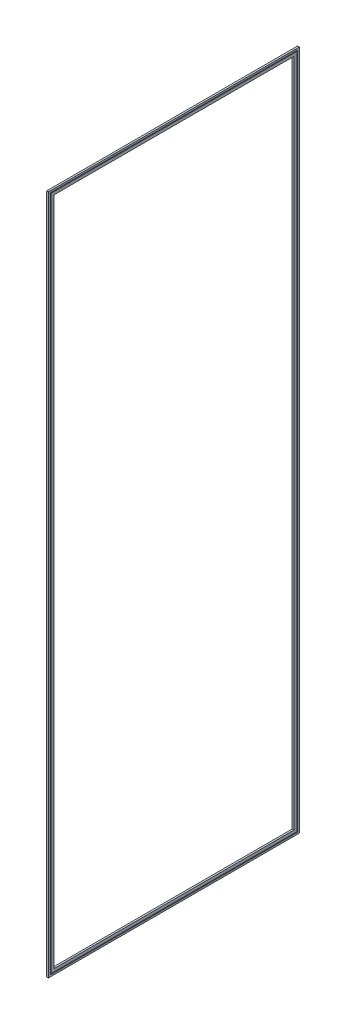
ISO-10303-21;
HEADER;
FILE_DESCRIPTION(('STEP AP214'),'2;1');
FILE_NAME('part.step','',(''),(''),'','','');
FILE_SCHEMA(('AUTOMOTIVE_DESIGN { 1 0 10303 214 1 1 1 1 }'));
ENDSEC;
DATA;
#1=APPLICATION_CONTEXT('core data for automotive mechanical design processes');
#2=APPLICATION_PROTOCOL_DEFINITION('international standard','automotive_design',2000,#1);
#3=PRODUCT_CONTEXT('',#1,'mechanical');
#4=PRODUCT('Part','Part','',(#3));
#5=PRODUCT_RELATED_PRODUCT_CATEGORY('part','',(#4));
#6=PRODUCT_DEFINITION_FORMATION('','',#4);
#7=PRODUCT_DEFINITION_CONTEXT('part definition',#1,'design');
#8=PRODUCT_DEFINITION('design','',#6,#7);
#9=PRODUCT_DEFINITION_SHAPE('','',#8);
#10=(LENGTH_UNIT() NAMED_UNIT(*) SI_UNIT(.MILLI.,.METRE.));
#11=(NAMED_UNIT(*) PLANE_ANGLE_UNIT() SI_UNIT($,.RADIAN.));
#12=(NAMED_UNIT(*) SI_UNIT($,.STERADIAN.) SOLID_ANGLE_UNIT());
#13=UNCERTAINTY_MEASURE_WITH_UNIT(LENGTH_MEASURE(1.E-05),#10,'distance_accuracy_value','');
#14=(GEOMETRIC_REPRESENTATION_CONTEXT(3) GLOBAL_UNCERTAINTY_ASSIGNED_CONTEXT((#13)) GLOBAL_UNIT_ASSIGNED_CONTEXT((#10,
#11,#12)) REPRESENTATION_CONTEXT('',''));
#15=CARTESIAN_POINT('',(0.,0.,0.));
#16=DIRECTION('',(0.,0.,1.));
#17=DIRECTION('',(1.,0.,0.));
#18=AXIS2_PLACEMENT_3D('',#15,#16,#17);
#19=CARTESIAN_POINT('',(0.4,-189.,69.0000000000001));
#20=DIRECTION('',(0.,-1.,0.));
#21=DIRECTION('',(0.,0.,-1.));
#22=AXIS2_PLACEMENT_3D('',#19,#20,#21);
#23=PLANE('',#22);
#24=DIRECTION('',(0.,0.,1.));
#25=VECTOR('',#24,1.);
#26=CARTESIAN_POINT('',(0.799999999999995,-189.,-68.9999999999999));
#27=LINE('',#26,#25);
#28=CARTESIAN_POINT('',(0.799999999999974,-189.,-69.0000000000001));
#29=VERTEX_POINT('',#28);
#30=CARTESIAN_POINT('',(0.800000000000002,-189.,69.0000000000001));
#31=VERTEX_POINT('',#30);
#32=EDGE_CURVE('E63',#29,#31,#27,.T.);
#33=ORIENTED_EDGE('',*,*,#32,.T.);
#34=DIRECTION('',(1.,0.,0.));
#35=VECTOR('',#34,1.);
#36=CARTESIAN_POINT('',(0.4,-189.,69.0000000000001));
#37=LINE('',#36,#35);
#38=CARTESIAN_POINT('',(1.,-189.,69.0000000000001));
#39=VERTEX_POINT('',#38);
#40=EDGE_CURVE('E306',#31,#39,#37,.T.);
#41=ORIENTED_EDGE('',*,*,#40,.T.);
#42=DIRECTION('',(0.,0.,-1.));
#43=VECTOR('',#42,1.);
#44=CARTESIAN_POINT('',(1.,-189.,69.0000000000001));
#45=LINE('',#44,#43);
#46=CARTESIAN_POINT('',(1.,-189.,-69.0000000000001));
#47=VERTEX_POINT('',#46);
#48=EDGE_CURVE('E271',#39,#47,#45,.T.);
#49=ORIENTED_EDGE('',*,*,#48,.T.);
#50=DIRECTION('',(1.,0.,0.));
#51=VECTOR('',#50,1.);
#52=CARTESIAN_POINT('',(0.4,-189.,-69.0000000000001));
#53=LINE('',#52,#51);
#54=EDGE_CURVE('E291',#29,#47,#53,.T.);
#55=ORIENTED_EDGE('',*,*,#54,.F.);
#56=EDGE_LOOP('',(#33,#41,#49,#55));
#57=FACE_BOUND('',#56,.T.);
#58=ADVANCED_FACE('F48',(#57),#23,.F.);
#59=CARTESIAN_POINT('',(0.4,189.,69.0000000000001));
#60=DIRECTION('',(0.,0.,1.));
#61=DIRECTION('',(1.,0.,0.));
#62=AXIS2_PLACEMENT_3D('',#59,#60,#61);
#63=PLANE('',#62);
#64=DIRECTION('',(0.,1.,0.));
#65=VECTOR('',#64,1.);
#66=CARTESIAN_POINT('',(0.800000000000002,-189.,69.0000000000001));
#67=LINE('',#66,#65);
#68=CARTESIAN_POINT('',(0.799999999999961,189.,69.0000000000002));
#69=VERTEX_POINT('',#68);
#70=EDGE_CURVE('E228',#31,#69,#67,.T.);
#71=ORIENTED_EDGE('',*,*,#70,.T.);
#72=DIRECTION('',(1.,0.,0.));
#73=VECTOR('',#72,1.);
#74=CARTESIAN_POINT('',(0.4,189.,69.0000000000001));
#75=LINE('',#74,#73);
#76=CARTESIAN_POINT('',(1.,189.,69.0000000000001));
#77=VERTEX_POINT('',#76);
#78=EDGE_CURVE('E310',#69,#77,#75,.T.);
#79=ORIENTED_EDGE('',*,*,#78,.T.);
#80=DIRECTION('',(0.,-1.,0.));
#81=VECTOR('',#80,1.);
#82=CARTESIAN_POINT('',(1.,189.,69.0000000000001));
#83=LINE('',#82,#81);
#84=EDGE_CURVE('E282',#77,#39,#83,.T.);
#85=ORIENTED_EDGE('',*,*,#84,.T.);
#86=ORIENTED_EDGE('',*,*,#40,.F.);
#87=EDGE_LOOP('',(#71,#79,#85,#86));
#88=FACE_BOUND('',#87,.T.);
#89=ADVANCED_FACE('F401',(#88),#63,.F.);
#90=CARTESIAN_POINT('',(0.4,189.,69.0000000000001));
#91=DIRECTION('',(0.,1.,0.));
#92=DIRECTION('',(0.,0.,1.));
#93=AXIS2_PLACEMENT_3D('',#90,#91,#92);
#94=PLANE('',#93);
#95=DIRECTION('',(0.,0.,1.));
#96=VECTOR('',#95,1.);
#97=CARTESIAN_POINT('',(0.799999999999954,189.,-68.9999999999998));
#98=LINE('',#97,#96);
#99=CARTESIAN_POINT('',(0.799999999999954,189.,-68.9999999999998));
#100=VERTEX_POINT('',#99);
#101=EDGE_CURVE('E226',#100,#69,#98,.T.);
#102=ORIENTED_EDGE('',*,*,#101,.F.);
#103=DIRECTION('',(1.,0.,0.));
#104=VECTOR('',#103,1.);
#105=CARTESIAN_POINT('',(0.4,189.,-69.0000000000001));
#106=LINE('',#105,#104);
#107=CARTESIAN_POINT('',(1.,189.,-69.0000000000001));
#108=VERTEX_POINT('',#107);
#109=EDGE_CURVE('E314',#100,#108,#106,.T.);
#110=ORIENTED_EDGE('',*,*,#109,.T.);
#111=DIRECTION('',(0.,0.,1.));
#112=VECTOR('',#111,1.);
#113=CARTESIAN_POINT('',(1.,189.,69.0000000000001));
#114=LINE('',#113,#112);
#115=EDGE_CURVE('E297',#108,#77,#114,.T.);
#116=ORIENTED_EDGE('',*,*,#115,.T.);
#117=ORIENTED_EDGE('',*,*,#78,.F.);
#118=EDGE_LOOP('',(#102,#110,#116,#117));
#119=FACE_BOUND('',#118,.T.);
#120=ADVANCED_FACE('F409',(#119),#94,.F.);
#121=CARTESIAN_POINT('',(0.4,189.,-69.0000000000001));
#122=DIRECTION('',(0.,0.,-1.));
#123=DIRECTION('',(-1.,0.,0.));
#124=AXIS2_PLACEMENT_3D('',#121,#122,#123);
#125=PLANE('',#124);
#126=DIRECTION('',(0.,1.,0.));
#127=VECTOR('',#126,1.);
#128=CARTESIAN_POINT('',(0.799999999999995,-189.,-68.9999999999999));
#129=LINE('',#128,#127);
#130=EDGE_CURVE('E224',#29,#100,#129,.T.);
#131=ORIENTED_EDGE('',*,*,#130,.F.);
#132=ORIENTED_EDGE('',*,*,#54,.T.);
#133=DIRECTION('',(0.,1.,0.));
#134=VECTOR('',#133,1.);
#135=CARTESIAN_POINT('',(1.,189.,-69.0000000000001));
#136=LINE('',#135,#134);
#137=EDGE_CURVE('E294',#47,#108,#136,.T.);
#138=ORIENTED_EDGE('',*,*,#137,.T.);
#139=ORIENTED_EDGE('',*,*,#109,.F.);
#140=EDGE_LOOP('',(#131,#132,#138,#139));
#141=FACE_BOUND('',#140,.T.);
#142=ADVANCED_FACE('F477',(#141),#125,.F.);
#143=CARTESIAN_POINT('',(1.,0.,0.));
#144=DIRECTION('',(-1.,0.,0.));
#145=DIRECTION('',(0.,0.,1.));
#146=AXIS2_PLACEMENT_3D('',#143,#144,#145);
#147=PLANE('',#146);
#148=DIRECTION('',(0.,1.,0.));
#149=VECTOR('',#148,1.);
#150=CARTESIAN_POINT('',(1.,-187.,-66.9999999999999));
#151=LINE('',#150,#149);
#152=CARTESIAN_POINT('',(1.,-187.,-66.9999999999999));
#153=VERTEX_POINT('',#152);
#154=CARTESIAN_POINT('',(1.,187.,-66.9999999999999));
#155=VERTEX_POINT('',#154);
#156=EDGE_CURVE('E318',#153,#155,#151,.T.);
#157=ORIENTED_EDGE('',*,*,#156,.F.);
#158=DIRECTION('',(0.,0.,-1.));
#159=VECTOR('',#158,1.);
#160=CARTESIAN_POINT('',(1.,-187.,-66.9999999999999));
#161=LINE('',#160,#159);
#162=CARTESIAN_POINT('',(1.,-187.,67.0000000000001));
#163=VERTEX_POINT('',#162);
#164=EDGE_CURVE('E326',#163,#153,#161,.T.);
#165=ORIENTED_EDGE('',*,*,#164,.F.);
#166=DIRECTION('',(0.,-1.,0.));
#167=VECTOR('',#166,1.);
#168=CARTESIAN_POINT('',(1.,-187.,67.0000000000001));
#169=LINE('',#168,#167);
#170=CARTESIAN_POINT('',(1.,187.,67.0000000000001));
#171=VERTEX_POINT('',#170);
#172=EDGE_CURVE('E323',#171,#163,#169,.T.);
#173=ORIENTED_EDGE('',*,*,#172,.F.);
#174=DIRECTION('',(0.,0.,1.));
#175=VECTOR('',#174,1.);
#176=CARTESIAN_POINT('',(1.,187.,-66.9999999999999));
#177=LINE('',#176,#175);
#178=EDGE_CURVE('E320',#155,#171,#177,.T.);
#179=ORIENTED_EDGE('',*,*,#178,.F.);
#180=EDGE_LOOP('',(#157,#165,#173,#179));
#181=FACE_BOUND('',#180,.T.);
#182=DIRECTION('',(0.,-1.,0.));
#183=VECTOR('',#182,1.);
#184=CARTESIAN_POINT('',(1.,188.6,68.6000000000001));
#185=LINE('',#184,#183);
#186=CARTESIAN_POINT('',(1.,188.6,68.6000000000001));
#187=VERTEX_POINT('',#186);
#188=CARTESIAN_POINT('',(1.,-188.6,68.6000000000001));
#189=VERTEX_POINT('',#188);
#190=EDGE_CURVE('E244',#187,#189,#185,.T.);
#191=ORIENTED_EDGE('',*,*,#190,.T.);
#192=DIRECTION('',(0.,0.,-1.));
#193=VECTOR('',#192,1.);
#194=CARTESIAN_POINT('',(1.,-188.6,68.6000000000001));
#195=LINE('',#194,#193);
#196=CARTESIAN_POINT('',(1.,-188.6,-68.6000000000001));
#197=VERTEX_POINT('',#196);
#198=EDGE_CURVE('E261',#189,#197,#195,.T.);
#199=ORIENTED_EDGE('',*,*,#198,.T.);
#200=DIRECTION('',(0.,1.,0.));
#201=VECTOR('',#200,1.);
#202=CARTESIAN_POINT('',(1.,188.6,-68.6000000000001));
#203=LINE('',#202,#201);
#204=CARTESIAN_POINT('',(1.,188.6,-68.6000000000001));
#205=VERTEX_POINT('',#204);
#206=EDGE_CURVE('E264',#197,#205,#203,.T.);
#207=ORIENTED_EDGE('',*,*,#206,.T.);
#208=DIRECTION('',(0.,0.,1.));
#209=VECTOR('',#208,1.);
#210=CARTESIAN_POINT('',(1.,188.6,68.6000000000001));
#211=LINE('',#210,#209);
#212=EDGE_CURVE('E249',#205,#187,#211,.T.);
#213=ORIENTED_EDGE('',*,*,#212,.T.);
#214=EDGE_LOOP('',(#191,#199,#207,#213));
#215=FACE_BOUND('',#214,.T.);
#216=ADVANCED_FACE('F480',(#181,#215),#147,.F.);
#217=ORIENTED_EDGE('',*,*,#137,.F.);
#218=ORIENTED_EDGE('',*,*,#48,.F.);
#219=ORIENTED_EDGE('',*,*,#84,.F.);
#220=ORIENTED_EDGE('',*,*,#115,.F.);
#221=EDGE_LOOP('',(#217,#218,#219,#220));
#222=FACE_BOUND('',#221,.T.);
#223=DIRECTION('',(0.,0.,1.));
#224=VECTOR('',#223,1.);
#225=CARTESIAN_POINT('',(1.,190.,-70.));
#226=LINE('',#225,#224);
#227=CARTESIAN_POINT('',(1.,190.,-70.));
#228=VERTEX_POINT('',#227);
#229=CARTESIAN_POINT('',(1.,190.,70.0000000000001));
#230=VERTEX_POINT('',#229);
#231=EDGE_CURVE('E349',#228,#230,#226,.T.);
#232=ORIENTED_EDGE('',*,*,#231,.T.);
#233=DIRECTION('',(0.,-1.,0.));
#234=VECTOR('',#233,1.);
#235=CARTESIAN_POINT('',(1.,-190.,70.0000000000001));
#236=LINE('',#235,#234);
#237=CARTESIAN_POINT('',(1.,-190.,70.0000000000001));
#238=VERTEX_POINT('',#237);
#239=EDGE_CURVE('E352',#230,#238,#236,.T.);
#240=ORIENTED_EDGE('',*,*,#239,.T.);
#241=DIRECTION('',(0.,0.,-1.));
#242=VECTOR('',#241,1.);
#243=CARTESIAN_POINT('',(1.,-190.,-70.));
#244=LINE('',#243,#242);
#245=CARTESIAN_POINT('',(1.,-190.,-70.));
#246=VERTEX_POINT('',#245);
#247=EDGE_CURVE('E355',#238,#246,#244,.T.);
#248=ORIENTED_EDGE('',*,*,#247,.T.);
#249=DIRECTION('',(0.,1.,0.));
#250=VECTOR('',#249,1.);
#251=CARTESIAN_POINT('',(1.,-190.,-70.));
#252=LINE('',#251,#250);
#253=EDGE_CURVE('E357',#246,#228,#252,.T.);
#254=ORIENTED_EDGE('',*,*,#253,.T.);
#255=EDGE_LOOP('',(#232,#240,#248,#254));
#256=FACE_BOUND('',#255,.T.);
#257=ADVANCED_FACE('F392',(#222,#256),#147,.F.);
#258=CARTESIAN_POINT('',(0.,0.,0.));
#259=DIRECTION('',(-1.,0.,0.));
#260=DIRECTION('',(0.,0.,1.));
#261=AXIS2_PLACEMENT_3D('',#258,#259,#260);
#262=PLANE('',#261);
#263=DIRECTION('',(0.,0.,1.));
#264=VECTOR('',#263,1.);
#265=CARTESIAN_POINT('',(0.,190.,-70.));
#266=LINE('',#265,#264);
#267=CARTESIAN_POINT('',(0.,190.,-70.));
#268=VERTEX_POINT('',#267);
#269=CARTESIAN_POINT('',(0.,190.,70.0000000000001));
#270=VERTEX_POINT('',#269);
#271=EDGE_CURVE('E348',#268,#270,#266,.T.);
#272=ORIENTED_EDGE('',*,*,#271,.F.);
#273=DIRECTION('',(0.,1.,0.));
#274=VECTOR('',#273,1.);
#275=CARTESIAN_POINT('',(0.,-190.,-70.));
#276=LINE('',#275,#274);
#277=CARTESIAN_POINT('',(0.,-190.,-70.));
#278=VERTEX_POINT('',#277);
#279=EDGE_CURVE('E353',#278,#268,#276,.T.);
#280=ORIENTED_EDGE('',*,*,#279,.F.);
#281=DIRECTION('',(0.,0.,-1.));
#282=VECTOR('',#281,1.);
#283=CARTESIAN_POINT('',(0.,-190.,-70.));
#284=LINE('',#283,#282);
#285=CARTESIAN_POINT('',(0.,-190.,70.0000000000001));
#286=VERTEX_POINT('',#285);
#287=EDGE_CURVE('E364',#286,#278,#284,.T.);
#288=ORIENTED_EDGE('',*,*,#287,.F.);
#289=DIRECTION('',(0.,-1.,0.));
#290=VECTOR('',#289,1.);
#291=CARTESIAN_POINT('',(0.,-190.,70.0000000000001));
#292=LINE('',#291,#290);
#293=EDGE_CURVE('E362',#270,#286,#292,.T.);
#294=ORIENTED_EDGE('',*,*,#293,.F.);
#295=EDGE_LOOP('',(#272,#280,#288,#294));
#296=FACE_BOUND('',#295,.T.);
#297=DIRECTION('',(0.,0.,-1.));
#298=VECTOR('',#297,1.);
#299=CARTESIAN_POINT('',(0.,-187.,-66.9999999999999));
#300=LINE('',#299,#298);
#301=CARTESIAN_POINT('',(0.,-187.,67.0000000000001));
#302=VERTEX_POINT('',#301);
#303=CARTESIAN_POINT('',(0.,-187.,-66.9999999999999));
#304=VERTEX_POINT('',#303);
#305=EDGE_CURVE('E321',#302,#304,#300,.T.);
#306=ORIENTED_EDGE('',*,*,#305,.T.);
#307=DIRECTION('',(0.,1.,0.));
#308=VECTOR('',#307,1.);
#309=CARTESIAN_POINT('',(0.,-187.,-66.9999999999999));
#310=LINE('',#309,#308);
#311=CARTESIAN_POINT('',(0.,187.,-66.9999999999999));
#312=VERTEX_POINT('',#311);
#313=EDGE_CURVE('E305',#304,#312,#310,.T.);
#314=ORIENTED_EDGE('',*,*,#313,.T.);
#315=DIRECTION('',(0.,0.,1.));
#316=VECTOR('',#315,1.);
#317=CARTESIAN_POINT('',(0.,187.,-66.9999999999999));
#318=LINE('',#317,#316);
#319=CARTESIAN_POINT('',(0.,187.,67.0000000000001));
#320=VERTEX_POINT('',#319);
#321=EDGE_CURVE('E331',#312,#320,#318,.T.);
#322=ORIENTED_EDGE('',*,*,#321,.T.);
#323=DIRECTION('',(0.,-1.,0.));
#324=VECTOR('',#323,1.);
#325=CARTESIAN_POINT('',(0.,-187.,67.0000000000001));
#326=LINE('',#325,#324);
#327=EDGE_CURVE('E334',#320,#302,#326,.T.);
#328=ORIENTED_EDGE('',*,*,#327,.T.);
#329=EDGE_LOOP('',(#306,#314,#322,#328));
#330=FACE_BOUND('',#329,.T.);
#331=ADVANCED_FACE('F382',(#296,#330),#262,.T.);
#332=CARTESIAN_POINT('',(1.,190.,-70.));
#333=DIRECTION('',(0.,-1.,0.));
#334=DIRECTION('',(0.,0.,-1.));
#335=AXIS2_PLACEMENT_3D('',#332,#333,#334);
#336=PLANE('',#335);
#337=ORIENTED_EDGE('',*,*,#271,.T.);
#338=DIRECTION('',(-1.,0.,0.));
#339=VECTOR('',#338,1.);
#340=CARTESIAN_POINT('',(1.,190.,70.0000000000001));
#341=LINE('',#340,#339);
#342=EDGE_CURVE('E12',#230,#270,#341,.T.);
#343=ORIENTED_EDGE('',*,*,#342,.F.);
#344=ORIENTED_EDGE('',*,*,#231,.F.);
#345=DIRECTION('',(-1.,0.,0.));
#346=VECTOR('',#345,1.);
#347=CARTESIAN_POINT('',(1.,190.,-70.));
#348=LINE('',#347,#346);
#349=EDGE_CURVE('E359',#228,#268,#348,.T.);
#350=ORIENTED_EDGE('',*,*,#349,.T.);
#351=EDGE_LOOP('',(#337,#343,#344,#350));
#352=FACE_BOUND('',#351,.T.);
#353=ADVANCED_FACE('F50',(#352),#336,.F.);
#354=CARTESIAN_POINT('',(1.,-190.,70.0000000000001));
#355=DIRECTION('',(0.,0.,-1.));
#356=DIRECTION('',(-1.,0.,0.));
#357=AXIS2_PLACEMENT_3D('',#354,#355,#356);
#358=PLANE('',#357);
#359=ORIENTED_EDGE('',*,*,#293,.T.);
#360=DIRECTION('',(-1.,0.,0.));
#361=VECTOR('',#360,1.);
#362=CARTESIAN_POINT('',(1.,-190.,70.0000000000001));
#363=LINE('',#362,#361);
#364=EDGE_CURVE('E56',#238,#286,#363,.T.);
#365=ORIENTED_EDGE('',*,*,#364,.F.);
#366=ORIENTED_EDGE('',*,*,#239,.F.);
#367=ORIENTED_EDGE('',*,*,#342,.T.);
#368=EDGE_LOOP('',(#359,#365,#366,#367));
#369=FACE_BOUND('',#368,.T.);
#370=ADVANCED_FACE('F393',(#369),#358,.F.);
#371=CARTESIAN_POINT('',(1.,-190.,-70.));
#372=DIRECTION('',(0.,1.,0.));
#373=DIRECTION('',(0.,0.,1.));
#374=AXIS2_PLACEMENT_3D('',#371,#372,#373);
#375=PLANE('',#374);
#376=ORIENTED_EDGE('',*,*,#287,.T.);
#377=DIRECTION('',(-1.,0.,0.));
#378=VECTOR('',#377,1.);
#379=CARTESIAN_POINT('',(1.,-190.,-70.));
#380=LINE('',#379,#378);
#381=EDGE_CURVE('E369',#246,#278,#380,.T.);
#382=ORIENTED_EDGE('',*,*,#381,.F.);
#383=ORIENTED_EDGE('',*,*,#247,.F.);
#384=ORIENTED_EDGE('',*,*,#364,.T.);
#385=EDGE_LOOP('',(#376,#382,#383,#384));
#386=FACE_BOUND('',#385,.T.);
#387=ADVANCED_FACE('F376',(#386),#375,.F.);
#388=CARTESIAN_POINT('',(1.,-190.,-70.));
#389=DIRECTION('',(0.,0.,1.));
#390=DIRECTION('',(1.,0.,0.));
#391=AXIS2_PLACEMENT_3D('',#388,#389,#390);
#392=PLANE('',#391);
#393=ORIENTED_EDGE('',*,*,#279,.T.);
#394=ORIENTED_EDGE('',*,*,#349,.F.);
#395=ORIENTED_EDGE('',*,*,#253,.F.);
#396=ORIENTED_EDGE('',*,*,#381,.T.);
#397=EDGE_LOOP('',(#393,#394,#395,#396));
#398=FACE_BOUND('',#397,.T.);
#399=ADVANCED_FACE('F386',(#398),#392,.F.);
#400=CARTESIAN_POINT('',(1.,-187.,-66.9999999999999));
#401=DIRECTION('',(0.,0.,1.));
#402=DIRECTION('',(1.,0.,0.));
#403=AXIS2_PLACEMENT_3D('',#400,#401,#402);
#404=PLANE('',#403);
#405=ORIENTED_EDGE('',*,*,#313,.F.);
#406=DIRECTION('',(-1.,0.,0.));
#407=VECTOR('',#406,1.);
#408=CARTESIAN_POINT('',(1.,-187.,-66.9999999999999));
#409=LINE('',#408,#407);
#410=EDGE_CURVE('E328',#153,#304,#409,.T.);
#411=ORIENTED_EDGE('',*,*,#410,.F.);
#412=ORIENTED_EDGE('',*,*,#156,.T.);
#413=DIRECTION('',(-1.,0.,0.));
#414=VECTOR('',#413,1.);
#415=CARTESIAN_POINT('',(1.,187.,-66.9999999999999));
#416=LINE('',#415,#414);
#417=EDGE_CURVE('E345',#155,#312,#416,.T.);
#418=ORIENTED_EDGE('',*,*,#417,.T.);
#419=EDGE_LOOP('',(#405,#411,#412,#418));
#420=FACE_BOUND('',#419,.T.);
#421=ADVANCED_FACE('F628',(#420),#404,.T.);
#422=CARTESIAN_POINT('',(1.,187.,-66.9999999999999));
#423=DIRECTION('',(0.,-1.,0.));
#424=DIRECTION('',(0.,0.,-1.));
#425=AXIS2_PLACEMENT_3D('',#422,#423,#424);
#426=PLANE('',#425);
#427=ORIENTED_EDGE('',*,*,#321,.F.);
#428=ORIENTED_EDGE('',*,*,#417,.F.);
#429=ORIENTED_EDGE('',*,*,#178,.T.);
#430=DIRECTION('',(-1.,0.,0.));
#431=VECTOR('',#430,1.);
#432=CARTESIAN_POINT('',(1.,187.,67.0000000000001));
#433=LINE('',#432,#431);
#434=EDGE_CURVE('E343',#171,#320,#433,.T.);
#435=ORIENTED_EDGE('',*,*,#434,.T.);
#436=EDGE_LOOP('',(#427,#428,#429,#435));
#437=FACE_BOUND('',#436,.T.);
#438=ADVANCED_FACE('F618',(#437),#426,.T.);
#439=CARTESIAN_POINT('',(1.,-187.,67.0000000000001));
#440=DIRECTION('',(0.,0.,-1.));
#441=DIRECTION('',(-1.,0.,0.));
#442=AXIS2_PLACEMENT_3D('',#439,#440,#441);
#443=PLANE('',#442);
#444=ORIENTED_EDGE('',*,*,#327,.F.);
#445=ORIENTED_EDGE('',*,*,#434,.F.);
#446=ORIENTED_EDGE('',*,*,#172,.T.);
#447=DIRECTION('',(-1.,0.,0.));
#448=VECTOR('',#447,1.);
#449=CARTESIAN_POINT('',(1.,-187.,67.0000000000001));
#450=LINE('',#449,#448);
#451=EDGE_CURVE('E341',#163,#302,#450,.T.);
#452=ORIENTED_EDGE('',*,*,#451,.T.);
#453=EDGE_LOOP('',(#444,#445,#446,#452));
#454=FACE_BOUND('',#453,.T.);
#455=ADVANCED_FACE('F425',(#454),#443,.T.);
#456=CARTESIAN_POINT('',(1.,-187.,-66.9999999999999));
#457=DIRECTION('',(0.,1.,0.));
#458=DIRECTION('',(0.,0.,1.));
#459=AXIS2_PLACEMENT_3D('',#456,#457,#458);
#460=PLANE('',#459);
#461=ORIENTED_EDGE('',*,*,#305,.F.);
#462=ORIENTED_EDGE('',*,*,#451,.F.);
#463=ORIENTED_EDGE('',*,*,#164,.T.);
#464=ORIENTED_EDGE('',*,*,#410,.T.);
#465=EDGE_LOOP('',(#461,#462,#463,#464));
#466=FACE_BOUND('',#465,.T.);
#467=ADVANCED_FACE('F416',(#466),#460,.T.);
#468=CARTESIAN_POINT('',(0.4,-189.,69.0000000000001));
#469=VERTEX_POINT('',#468);
#470=CARTESIAN_POINT('',(0.453589838486237,-189.,69.0000000000001));
#471=VERTEX_POINT('',#470);
#472=EDGE_CURVE('E302',#469,#471,#37,.T.);
#473=ORIENTED_EDGE('',*,*,#472,.T.);
#474=DIRECTION('',(0.,0.,-1.));
#475=VECTOR('',#474,1.);
#476=CARTESIAN_POINT('',(0.453589838486343,-189.,69.0000000000001));
#477=LINE('',#476,#475);
#478=CARTESIAN_POINT('',(0.453589838486576,-189.,-69.0000000000001));
#479=VERTEX_POINT('',#478);
#480=EDGE_CURVE('E239',#471,#479,#477,.T.);
#481=ORIENTED_EDGE('',*,*,#480,.T.);
#482=CARTESIAN_POINT('',(0.4,-189.,-69.0000000000001));
#483=VERTEX_POINT('',#482);
#484=EDGE_CURVE('E315',#483,#479,#53,.T.);
#485=ORIENTED_EDGE('',*,*,#484,.F.);
#486=DIRECTION('',(0.,0.,-1.));
#487=VECTOR('',#486,1.);
#488=CARTESIAN_POINT('',(0.4,-189.,69.0000000000001));
#489=LINE('',#488,#487);
#490=EDGE_CURVE('E278',#469,#483,#489,.T.);
#491=ORIENTED_EDGE('',*,*,#490,.F.);
#492=EDGE_LOOP('',(#473,#481,#485,#491));
#493=FACE_BOUND('',#492,.T.);
#494=ADVANCED_FACE('F404',(#493),#23,.F.);
#495=CARTESIAN_POINT('',(0.4,189.,69.0000000000001));
#496=VERTEX_POINT('',#495);
#497=CARTESIAN_POINT('',(0.453589838485658,189.,68.9999999999999));
#498=VERTEX_POINT('',#497);
#499=EDGE_CURVE('E307',#496,#498,#75,.T.);
#500=ORIENTED_EDGE('',*,*,#499,.T.);
#501=DIRECTION('',(0.,-1.,0.));
#502=VECTOR('',#501,1.);
#503=CARTESIAN_POINT('',(0.453589838485938,189.,69.0000000000001));
#504=LINE('',#503,#502);
#505=EDGE_CURVE('E232',#498,#471,#504,.T.);
#506=ORIENTED_EDGE('',*,*,#505,.T.);
#507=ORIENTED_EDGE('',*,*,#472,.F.);
#508=DIRECTION('',(0.,-1.,0.));
#509=VECTOR('',#508,1.);
#510=CARTESIAN_POINT('',(0.4,189.,69.0000000000001));
#511=LINE('',#510,#509);
#512=EDGE_CURVE('E288',#496,#469,#511,.T.);
#513=ORIENTED_EDGE('',*,*,#512,.F.);
#514=EDGE_LOOP('',(#500,#506,#507,#513));
#515=FACE_BOUND('',#514,.T.);
#516=ADVANCED_FACE('F412',(#515),#63,.F.);
#517=CARTESIAN_POINT('',(0.4,189.,-69.0000000000001));
#518=VERTEX_POINT('',#517);
#519=CARTESIAN_POINT('',(0.453589838485548,189.,-69.0000000000001));
#520=VERTEX_POINT('',#519);
#521=EDGE_CURVE('E311',#518,#520,#106,.T.);
#522=ORIENTED_EDGE('',*,*,#521,.T.);
#523=DIRECTION('',(0.,0.,1.));
#524=VECTOR('',#523,1.);
#525=CARTESIAN_POINT('',(0.453589838485648,189.,69.0000000000001));
#526=LINE('',#525,#524);
#527=EDGE_CURVE('E211',#520,#498,#526,.T.);
#528=ORIENTED_EDGE('',*,*,#527,.T.);
#529=ORIENTED_EDGE('',*,*,#499,.F.);
#530=DIRECTION('',(0.,0.,1.));
#531=VECTOR('',#530,1.);
#532=CARTESIAN_POINT('',(0.4,189.,69.0000000000001));
#533=LINE('',#532,#531);
#534=EDGE_CURVE('E285',#518,#496,#533,.T.);
#535=ORIENTED_EDGE('',*,*,#534,.F.);
#536=EDGE_LOOP('',(#522,#528,#529,#535));
#537=FACE_BOUND('',#536,.T.);
#538=ADVANCED_FACE('F422',(#537),#94,.F.);
#539=ORIENTED_EDGE('',*,*,#484,.T.);
#540=DIRECTION('',(0.,1.,0.));
#541=VECTOR('',#540,1.);
#542=CARTESIAN_POINT('',(0.453589838486655,189.,-69.0000000000001));
#543=LINE('',#542,#541);
#544=EDGE_CURVE('E242',#479,#520,#543,.T.);
#545=ORIENTED_EDGE('',*,*,#544,.T.);
#546=ORIENTED_EDGE('',*,*,#521,.F.);
#547=DIRECTION('',(0.,1.,0.));
#548=VECTOR('',#547,1.);
#549=CARTESIAN_POINT('',(0.4,189.,-69.0000000000001));
#550=LINE('',#549,#548);
#551=EDGE_CURVE('E281',#483,#518,#550,.T.);
#552=ORIENTED_EDGE('',*,*,#551,.F.);
#553=EDGE_LOOP('',(#539,#545,#546,#552));
#554=FACE_BOUND('',#553,.T.);
#555=ADVANCED_FACE('F436',(#554),#125,.F.);
#556=CARTESIAN_POINT('',(0.4,0.,0.));
#557=DIRECTION('',(-1.,0.,0.));
#558=DIRECTION('',(0.,0.,1.));
#559=AXIS2_PLACEMENT_3D('',#556,#557,#558);
#560=PLANE('',#559);
#561=ORIENTED_EDGE('',*,*,#490,.T.);
#562=ORIENTED_EDGE('',*,*,#551,.T.);
#563=ORIENTED_EDGE('',*,*,#534,.T.);
#564=ORIENTED_EDGE('',*,*,#512,.T.);
#565=EDGE_LOOP('',(#561,#562,#563,#564));
#566=FACE_BOUND('',#565,.T.);
#567=DIRECTION('',(0.,-1.,0.));
#568=VECTOR('',#567,1.);
#569=CARTESIAN_POINT('',(0.4,188.6,68.6000000000001));
#570=LINE('',#569,#568);
#571=CARTESIAN_POINT('',(0.4,188.6,68.6000000000001));
#572=VERTEX_POINT('',#571);
#573=CARTESIAN_POINT('',(0.4,-188.6,68.6000000000001));
#574=VERTEX_POINT('',#573);
#575=EDGE_CURVE('E245',#572,#574,#570,.T.);
#576=ORIENTED_EDGE('',*,*,#575,.F.);
#577=DIRECTION('',(0.,0.,1.));
#578=VECTOR('',#577,1.);
#579=CARTESIAN_POINT('',(0.4,188.6,68.6000000000001));
#580=LINE('',#579,#578);
#581=CARTESIAN_POINT('',(0.4,188.6,-68.6000000000001));
#582=VERTEX_POINT('',#581);
#583=EDGE_CURVE('E255',#582,#572,#580,.T.);
#584=ORIENTED_EDGE('',*,*,#583,.F.);
#585=DIRECTION('',(0.,1.,0.));
#586=VECTOR('',#585,1.);
#587=CARTESIAN_POINT('',(0.4,188.6,-68.6000000000001));
#588=LINE('',#587,#586);
#589=CARTESIAN_POINT('',(0.4,-188.6,-68.6000000000001));
#590=VERTEX_POINT('',#589);
#591=EDGE_CURVE('E252',#590,#582,#588,.T.);
#592=ORIENTED_EDGE('',*,*,#591,.F.);
#593=DIRECTION('',(0.,0.,-1.));
#594=VECTOR('',#593,1.);
#595=CARTESIAN_POINT('',(0.4,-188.6,68.6000000000001));
#596=LINE('',#595,#594);
#597=EDGE_CURVE('E248',#574,#590,#596,.T.);
#598=ORIENTED_EDGE('',*,*,#597,.F.);
#599=EDGE_LOOP('',(#576,#584,#592,#598));
#600=FACE_BOUND('',#599,.T.);
#601=ADVANCED_FACE('F470',(#566,#600),#560,.F.);
#602=CARTESIAN_POINT('',(0.4,188.6,68.6000000000001));
#603=DIRECTION('',(0.,0.,1.));
#604=DIRECTION('',(1.,0.,0.));
#605=AXIS2_PLACEMENT_3D('',#602,#603,#604);
#606=PLANE('',#605);
#607=ORIENTED_EDGE('',*,*,#190,.F.);
#608=DIRECTION('',(1.,0.,0.));
#609=VECTOR('',#608,1.);
#610=CARTESIAN_POINT('',(0.4,188.6,68.6000000000001));
#611=LINE('',#610,#609);
#612=EDGE_CURVE('E269',#572,#187,#611,.T.);
#613=ORIENTED_EDGE('',*,*,#612,.F.);
#614=ORIENTED_EDGE('',*,*,#575,.T.);
#615=DIRECTION('',(1.,0.,0.));
#616=VECTOR('',#615,1.);
#617=CARTESIAN_POINT('',(0.4,-188.6,68.6000000000001));
#618=LINE('',#617,#616);
#619=EDGE_CURVE('E258',#574,#189,#618,.T.);
#620=ORIENTED_EDGE('',*,*,#619,.T.);
#621=EDGE_LOOP('',(#607,#613,#614,#620));
#622=FACE_BOUND('',#621,.T.);
#623=ADVANCED_FACE('F461',(#622),#606,.T.);
#624=CARTESIAN_POINT('',(0.4,188.6,68.6000000000001));
#625=DIRECTION('',(0.,1.,0.));
#626=DIRECTION('',(0.,0.,1.));
#627=AXIS2_PLACEMENT_3D('',#624,#625,#626);
#628=PLANE('',#627);
#629=ORIENTED_EDGE('',*,*,#212,.F.);
#630=DIRECTION('',(1.,0.,0.));
#631=VECTOR('',#630,1.);
#632=CARTESIAN_POINT('',(0.4,188.6,-68.6000000000001));
#633=LINE('',#632,#631);
#634=EDGE_CURVE('E272',#582,#205,#633,.T.);
#635=ORIENTED_EDGE('',*,*,#634,.F.);
#636=ORIENTED_EDGE('',*,*,#583,.T.);
#637=ORIENTED_EDGE('',*,*,#612,.T.);
#638=EDGE_LOOP('',(#629,#635,#636,#637));
#639=FACE_BOUND('',#638,.T.);
#640=ADVANCED_FACE('F457',(#639),#628,.T.);
#641=CARTESIAN_POINT('',(0.4,188.6,-68.6000000000001));
#642=DIRECTION('',(0.,0.,-1.));
#643=DIRECTION('',(0.,1.,0.));
#644=AXIS2_PLACEMENT_3D('',#641,#642,#643);
#645=PLANE('',#644);
#646=ORIENTED_EDGE('',*,*,#206,.F.);
#647=DIRECTION('',(1.,0.,0.));
#648=VECTOR('',#647,1.);
#649=CARTESIAN_POINT('',(0.4,-188.6,-68.6000000000001));
#650=LINE('',#649,#648);
#651=EDGE_CURVE('E274',#590,#197,#650,.T.);
#652=ORIENTED_EDGE('',*,*,#651,.F.);
#653=ORIENTED_EDGE('',*,*,#591,.T.);
#654=ORIENTED_EDGE('',*,*,#634,.T.);
#655=EDGE_LOOP('',(#646,#652,#653,#654));
#656=FACE_BOUND('',#655,.T.);
#657=ADVANCED_FACE('F460',(#656),#645,.T.);
#658=CARTESIAN_POINT('',(0.4,-188.6,68.6000000000001));
#659=DIRECTION('',(0.,-1.,0.));
#660=DIRECTION('',(0.,0.,-1.));
#661=AXIS2_PLACEMENT_3D('',#658,#659,#660);
#662=PLANE('',#661);
#663=ORIENTED_EDGE('',*,*,#198,.F.);
#664=ORIENTED_EDGE('',*,*,#619,.F.);
#665=ORIENTED_EDGE('',*,*,#597,.T.);
#666=ORIENTED_EDGE('',*,*,#651,.T.);
#667=EDGE_LOOP('',(#663,#664,#665,#666));
#668=FACE_BOUND('',#667,.T.);
#669=ADVANCED_FACE('F446',(#668),#662,.T.);
#670=CARTESIAN_POINT('',(0.399999999999973,2.19966295673009E-13,-68.969059892324));
#671=DIRECTION('',(-0.499999999999994,0.,-0.866025403784442));
#672=DIRECTION('',(0.,1.,0.));
#673=AXIS2_PLACEMENT_3D('',#670,#671,#672);
#674=PLANE('',#673);
#675=DIRECTION('',(-0.774596669241479,0.447213595499975,0.447213595499949));
#676=VECTOR('',#675,1.);
#677=CARTESIAN_POINT('',(-65.0608025584085,-151.175247913856,-31.1752479138586));
#678=LINE('',#677,#676);
#679=CARTESIAN_POINT('',(0.799999999999995,-189.2,-69.1999999999999));
#680=VERTEX_POINT('',#679);
#681=EDGE_CURVE('E198',#479,#680,#678,.F.);
#682=ORIENTED_EDGE('',*,*,#681,.T.);
#683=DIRECTION('',(0.,-1.,0.));
#684=VECTOR('',#683,1.);
#685=CARTESIAN_POINT('',(0.799999999999954,189.2,-69.1999999999998));
#686=LINE('',#685,#684);
#687=CARTESIAN_POINT('',(0.799999999999954,189.2,-69.1999999999998));
#688=VERTEX_POINT('',#687);
#689=EDGE_CURVE('E195',#688,#680,#686,.T.);
#690=ORIENTED_EDGE('',*,*,#689,.F.);
#691=DIRECTION('',(0.774596669241488,0.447213595499954,-0.447213595499954));
#692=VECTOR('',#691,1.);
#693=CARTESIAN_POINT('',(-65.0608025584062,151.17524791386,-31.1752479138598));
#694=LINE('',#693,#692);
#695=EDGE_CURVE('E71',#688,#520,#694,.F.);
#696=ORIENTED_EDGE('',*,*,#695,.T.);
#697=ORIENTED_EDGE('',*,*,#544,.F.);
#698=EDGE_LOOP('',(#682,#690,#696,#697));
#699=FACE_BOUND('',#698,.T.);
#700=ADVANCED_FACE('F196',(#699),#674,.F.);
#701=CARTESIAN_POINT('',(0.399999999999998,-188.969059892324,1.06420525397903E-13));
#702=DIRECTION('',(-0.500000000000017,-0.866025403784429,0.));
#703=DIRECTION('',(0.,0.,-1.));
#704=AXIS2_PLACEMENT_3D('',#701,#702,#703);
#705=PLANE('',#704);
#706=DIRECTION('',(-0.774596669241479,0.447213595499975,-0.447213595499948));
#707=VECTOR('',#706,1.);
#708=CARTESIAN_POINT('',(-23.4915831767526,-175.175247913859,55.17524791386));
#709=LINE('',#708,#707);
#710=CARTESIAN_POINT('',(0.800000000000002,-189.2,69.2000000000001));
#711=VERTEX_POINT('',#710);
#712=EDGE_CURVE('E213',#471,#711,#709,.F.);
#713=ORIENTED_EDGE('',*,*,#712,.T.);
#714=DIRECTION('',(0.,0.,1.));
#715=VECTOR('',#714,1.);
#716=CARTESIAN_POINT('',(0.799999999999995,-189.2,-69.1999999999999));
#717=LINE('',#716,#715);
#718=EDGE_CURVE('E203',#680,#711,#717,.T.);
#719=ORIENTED_EDGE('',*,*,#718,.F.);
#720=ORIENTED_EDGE('',*,*,#681,.F.);
#721=ORIENTED_EDGE('',*,*,#480,.F.);
#722=EDGE_LOOP('',(#713,#719,#720,#721));
#723=FACE_BOUND('',#722,.T.);
#724=ADVANCED_FACE('F438',(#723),#705,.F.);
#725=CARTESIAN_POINT('',(0.399999999999956,188.969059892324,2.08987823505434E-13));
#726=DIRECTION('',(-0.499999999999994,0.866025403784442,0.));
#727=DIRECTION('',(0.,0.,1.));
#728=AXIS2_PLACEMENT_3D('',#725,#726,#727);
#729=PLANE('',#728);
#730=ORIENTED_EDGE('',*,*,#695,.F.);
#731=DIRECTION('',(0.,0.,-1.));
#732=VECTOR('',#731,1.);
#733=CARTESIAN_POINT('',(0.799999999999961,189.2,69.2000000000002));
#734=LINE('',#733,#732);
#735=CARTESIAN_POINT('',(0.799999999999961,189.2,69.2000000000002));
#736=VERTEX_POINT('',#735);
#737=EDGE_CURVE('E204',#736,#688,#734,.T.);
#738=ORIENTED_EDGE('',*,*,#737,.F.);
#739=DIRECTION('',(0.774596669241488,0.447213595499954,0.447213595499954));
#740=VECTOR('',#739,1.);
#741=CARTESIAN_POINT('',(-23.4915831767532,175.17524791386,55.1752479138598));
#742=LINE('',#741,#740);
#743=EDGE_CURVE('E233',#736,#498,#742,.F.);
#744=ORIENTED_EDGE('',*,*,#743,.T.);
#745=ORIENTED_EDGE('',*,*,#527,.F.);
#746=EDGE_LOOP('',(#730,#738,#744,#745));
#747=FACE_BOUND('',#746,.T.);
#748=ADVANCED_FACE('F207',(#747),#729,.F.);
#749=CARTESIAN_POINT('',(0.39999999999998,1.68700280434989E-13,68.9690598923243));
#750=DIRECTION('',(-0.499999999999994,0.,0.866025403784442));
#751=DIRECTION('',(0.,-1.,0.));
#752=AXIS2_PLACEMENT_3D('',#749,#750,#751);
#753=PLANE('',#752);
#754=ORIENTED_EDGE('',*,*,#743,.F.);
#755=DIRECTION('',(0.,1.,0.));
#756=VECTOR('',#755,1.);
#757=CARTESIAN_POINT('',(0.800000000000002,-189.2,69.2000000000001));
#758=LINE('',#757,#756);
#759=EDGE_CURVE('E217',#711,#736,#758,.T.);
#760=ORIENTED_EDGE('',*,*,#759,.F.);
#761=ORIENTED_EDGE('',*,*,#712,.F.);
#762=ORIENTED_EDGE('',*,*,#505,.F.);
#763=EDGE_LOOP('',(#754,#760,#761,#762));
#764=FACE_BOUND('',#763,.T.);
#765=ADVANCED_FACE('F431',(#764),#753,.F.);
#766=CARTESIAN_POINT('',(0.799999999999978,1.94377546798595E-13,1.3873346915716E-13));
#767=DIRECTION('',(-1.,0.,0.));
#768=DIRECTION('',(0.,0.,-1.));
#769=AXIS2_PLACEMENT_3D('',#766,#767,#768);
#770=PLANE('',#769);
#771=ORIENTED_EDGE('',*,*,#130,.T.);
#772=ORIENTED_EDGE('',*,*,#101,.T.);
#773=ORIENTED_EDGE('',*,*,#70,.F.);
#774=ORIENTED_EDGE('',*,*,#32,.F.);
#775=EDGE_LOOP('',(#771,#772,#773,#774));
#776=FACE_BOUND('',#775,.T.);
#777=ORIENTED_EDGE('',*,*,#737,.T.);
#778=ORIENTED_EDGE('',*,*,#689,.T.);
#779=ORIENTED_EDGE('',*,*,#718,.T.);
#780=ORIENTED_EDGE('',*,*,#759,.T.);
#781=EDGE_LOOP('',(#777,#778,#779,#780));
#782=FACE_BOUND('',#781,.T.);
#783=ADVANCED_FACE('F215',(#776,#782),#770,.T.);
#784=CLOSED_SHELL('',(#58,#89,#120,#142,#216,#257,#331,#353,#370,#387,#399,#421,#438,#455,#467,
#494,#516,#538,#555,#601,#623,#640,#657,#669,#700,#724,#748,#765,#783));
#785=MANIFOLD_SOLID_BREP('B2',#784);
#786=ADVANCED_BREP_SHAPE_REPRESENTATION('',(#18,#785),#14);
#787=SHAPE_DEFINITION_REPRESENTATION(#9,#786);
ENDSEC;
END-ISO-10303-21;
